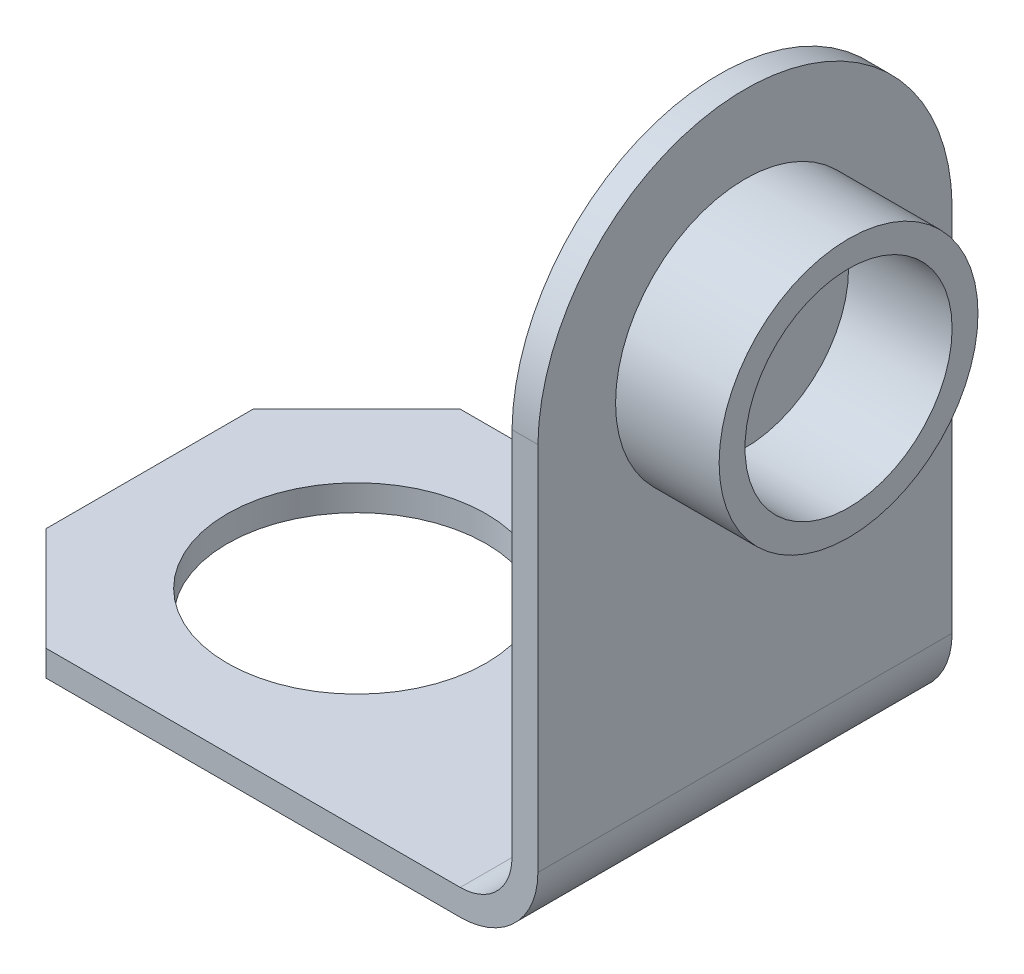
ISO-10303-21;
HEADER;
FILE_DESCRIPTION(('STEP AP214'),'2;1');
FILE_NAME('part.step','',(''),(''),'','','');
FILE_SCHEMA(('AUTOMOTIVE_DESIGN { 1 0 10303 214 1 1 1 1 }'));
ENDSEC;
DATA;
#1=APPLICATION_CONTEXT('core data for automotive mechanical design processes');
#2=APPLICATION_PROTOCOL_DEFINITION('international standard','automotive_design',2000,#1);
#3=PRODUCT_CONTEXT('',#1,'mechanical');
#4=PRODUCT('Part','Part','',(#3));
#5=PRODUCT_RELATED_PRODUCT_CATEGORY('part','',(#4));
#6=PRODUCT_DEFINITION_FORMATION('','',#4);
#7=PRODUCT_DEFINITION_CONTEXT('part definition',#1,'design');
#8=PRODUCT_DEFINITION('design','',#6,#7);
#9=PRODUCT_DEFINITION_SHAPE('','',#8);
#10=(LENGTH_UNIT() NAMED_UNIT(*) SI_UNIT(.MILLI.,.METRE.));
#11=(NAMED_UNIT(*) PLANE_ANGLE_UNIT() SI_UNIT($,.RADIAN.));
#12=(NAMED_UNIT(*) SI_UNIT($,.STERADIAN.) SOLID_ANGLE_UNIT());
#13=UNCERTAINTY_MEASURE_WITH_UNIT(LENGTH_MEASURE(1.E-05),#10,'distance_accuracy_value','');
#14=(GEOMETRIC_REPRESENTATION_CONTEXT(3) GLOBAL_UNCERTAINTY_ASSIGNED_CONTEXT((#13)) GLOBAL_UNIT_ASSIGNED_CONTEXT((#10,
#11,#12)) REPRESENTATION_CONTEXT('',''));
#15=CARTESIAN_POINT('',(0.,0.,0.));
#16=DIRECTION('',(0.,0.,1.));
#17=DIRECTION('',(1.,0.,0.));
#18=AXIS2_PLACEMENT_3D('',#15,#16,#17);
#19=CARTESIAN_POINT('',(55.,7.5,-40.));
#20=DIRECTION('',(-1.,0.,0.));
#21=DIRECTION('',(0.,0.,1.));
#22=AXIS2_PLACEMENT_3D('',#19,#20,#21);
#23=PLANE('',#22);
#24=CARTESIAN_POINT('',(55.,42.9979975021565,-20.));
#25=DIRECTION('',(-1.,0.,0.));
#26=DIRECTION('',(0.,0.,1.));
#27=AXIS2_PLACEMENT_3D('',#24,#25,#26);
#28=CIRCLE('',#27,20.0020024978435);
#29=CARTESIAN_POINT('',(55.,43.2810238679564,-40.));
#30=VERTEX_POINT('',#29);
#31=CARTESIAN_POINT('',(55.,43.2810238679555,0.));
#32=VERTEX_POINT('',#31);
#33=EDGE_CURVE('E136',#30,#32,#28,.F.);
#34=ORIENTED_EDGE('',*,*,#33,.F.);
#35=DIRECTION('',(0.,-1.,0.));
#36=VECTOR('',#35,1.);
#37=CARTESIAN_POINT('',(55.,7.5,-40.));
#38=LINE('',#37,#36);
#39=CARTESIAN_POINT('',(55.,7.5,-40.));
#40=VERTEX_POINT('',#39);
#41=EDGE_CURVE('E145',#30,#40,#38,.T.);
#42=ORIENTED_EDGE('',*,*,#41,.T.);
#43=DIRECTION('',(0.,0.,1.));
#44=VECTOR('',#43,1.);
#45=CARTESIAN_POINT('',(55.,7.5,-40.));
#46=LINE('',#45,#44);
#47=CARTESIAN_POINT('',(55.,7.5,0.));
#48=VERTEX_POINT('',#47);
#49=EDGE_CURVE('E181',#40,#48,#46,.T.);
#50=ORIENTED_EDGE('',*,*,#49,.T.);
#51=DIRECTION('',(0.,-1.,0.));
#52=VECTOR('',#51,1.);
#53=CARTESIAN_POINT('',(55.,7.5,0.));
#54=LINE('',#53,#52);
#55=EDGE_CURVE('E170',#32,#48,#54,.T.);
#56=ORIENTED_EDGE('',*,*,#55,.F.);
#57=EDGE_LOOP('',(#34,#42,#50,#56));
#58=FACE_BOUND('',#57,.T.);
#59=ADVANCED_FACE('F43',(#58),#23,.T.);
#60=CARTESIAN_POINT('',(57.5,7.5,-40.));
#61=DIRECTION('',(1.,0.,0.));
#62=DIRECTION('',(0.,0.,-1.));
#63=AXIS2_PLACEMENT_3D('',#60,#61,#62);
#64=PLANE('',#63);
#65=CARTESIAN_POINT('',(57.5,42.9979975021565,-20.));
#66=DIRECTION('',(1.,0.,0.));
#67=DIRECTION('',(0.,0.,-1.));
#68=AXIS2_PLACEMENT_3D('',#65,#66,#67);
#69=CIRCLE('',#68,12.5);
#70=CARTESIAN_POINT('',(57.5,42.9979975021565,-32.5));
#71=VERTEX_POINT('',#70);
#72=EDGE_CURVE('E218',#71,#71,#69,.T.);
#73=ORIENTED_EDGE('',*,*,#72,.F.);
#74=EDGE_LOOP('',(#73));
#75=FACE_BOUND('',#74,.T.);
#76=DIRECTION('',(0.,1.,0.));
#77=VECTOR('',#76,1.);
#78=CARTESIAN_POINT('',(57.5,7.5,-40.));
#79=LINE('',#78,#77);
#80=CARTESIAN_POINT('',(57.5,7.5,-40.));
#81=VERTEX_POINT('',#80);
#82=CARTESIAN_POINT('',(57.5,43.2810238679564,-40.));
#83=VERTEX_POINT('',#82);
#84=EDGE_CURVE('E142',#81,#83,#79,.T.);
#85=ORIENTED_EDGE('',*,*,#84,.T.);
#86=CARTESIAN_POINT('',(57.5,42.9979975021565,-20.));
#87=DIRECTION('',(1.,0.,0.));
#88=DIRECTION('',(0.,0.,-1.));
#89=AXIS2_PLACEMENT_3D('',#86,#87,#88);
#90=CIRCLE('',#89,20.0020024978435);
#91=CARTESIAN_POINT('',(57.5,43.2810238679555,0.));
#92=VERTEX_POINT('',#91);
#93=EDGE_CURVE('E125',#92,#83,#90,.F.);
#94=ORIENTED_EDGE('',*,*,#93,.F.);
#95=DIRECTION('',(0.,1.,0.));
#96=VECTOR('',#95,1.);
#97=CARTESIAN_POINT('',(57.5,7.5,0.));
#98=LINE('',#97,#96);
#99=CARTESIAN_POINT('',(57.5,7.5,0.));
#100=VERTEX_POINT('',#99);
#101=EDGE_CURVE('E168',#100,#92,#98,.T.);
#102=ORIENTED_EDGE('',*,*,#101,.F.);
#103=DIRECTION('',(0.,0.,1.));
#104=VECTOR('',#103,1.);
#105=CARTESIAN_POINT('',(57.5,7.5,-40.));
#106=LINE('',#105,#104);
#107=EDGE_CURVE('E149',#81,#100,#106,.T.);
#108=ORIENTED_EDGE('',*,*,#107,.F.);
#109=EDGE_LOOP('',(#85,#94,#102,#108));
#110=FACE_BOUND('',#109,.T.);
#111=ADVANCED_FACE('F148',(#75,#110),#64,.T.);
#112=CARTESIAN_POINT('',(0.,2.5,-40.));
#113=DIRECTION('',(-1.,0.,0.));
#114=DIRECTION('',(0.,0.,1.));
#115=AXIS2_PLACEMENT_3D('',#112,#113,#114);
#116=PLANE('',#115);
#117=DIRECTION('',(0.,0.,1.));
#118=VECTOR('',#117,1.);
#119=CARTESIAN_POINT('',(0.,2.5,-40.));
#120=LINE('',#119,#118);
#121=CARTESIAN_POINT('',(0.,2.5,-30.));
#122=VERTEX_POINT('',#121);
#123=CARTESIAN_POINT('',(0.,2.5,-10.));
#124=VERTEX_POINT('',#123);
#125=EDGE_CURVE('E177',#122,#124,#120,.T.);
#126=ORIENTED_EDGE('',*,*,#125,.F.);
#127=DIRECTION('',(0.,-1.,0.));
#128=VECTOR('',#127,1.);
#129=CARTESIAN_POINT('',(0.,0.,-30.));
#130=LINE('',#129,#128);
#131=CARTESIAN_POINT('',(0.,0.,-30.));
#132=VERTEX_POINT('',#131);
#133=EDGE_CURVE('E195',#122,#132,#130,.T.);
#134=ORIENTED_EDGE('',*,*,#133,.T.);
#135=DIRECTION('',(0.,0.,1.));
#136=VECTOR('',#135,1.);
#137=CARTESIAN_POINT('',(0.,0.,-40.));
#138=LINE('',#137,#136);
#139=CARTESIAN_POINT('',(0.,0.,-10.));
#140=VERTEX_POINT('',#139);
#141=EDGE_CURVE('E162',#132,#140,#138,.T.);
#142=ORIENTED_EDGE('',*,*,#141,.T.);
#143=DIRECTION('',(0.,1.,0.));
#144=VECTOR('',#143,1.);
#145=CARTESIAN_POINT('',(0.,2.5,-10.));
#146=LINE('',#145,#144);
#147=EDGE_CURVE('E193',#140,#124,#146,.T.);
#148=ORIENTED_EDGE('',*,*,#147,.T.);
#149=EDGE_LOOP('',(#126,#134,#142,#148));
#150=FACE_BOUND('',#149,.T.);
#151=ADVANCED_FACE('F209',(#150),#116,.T.);
#152=CARTESIAN_POINT('',(0.,2.5,-40.));
#153=DIRECTION('',(0.,1.,0.));
#154=DIRECTION('',(0.,0.,1.));
#155=AXIS2_PLACEMENT_3D('',#152,#153,#154);
#156=PLANE('',#155);
#157=CARTESIAN_POINT('',(20.,2.5,-20.));
#158=DIRECTION('',(0.,1.,0.));
#159=DIRECTION('',(0.,0.,1.));
#160=AXIS2_PLACEMENT_3D('',#157,#158,#159);
#161=CIRCLE('',#160,12.5);
#162=CARTESIAN_POINT('',(20.,2.5,-7.5));
#163=VERTEX_POINT('',#162);
#164=EDGE_CURVE('E222',#163,#163,#161,.T.);
#165=ORIENTED_EDGE('',*,*,#164,.F.);
#166=EDGE_LOOP('',(#165));
#167=FACE_BOUND('',#166,.T.);
#168=DIRECTION('',(-1.,0.,0.));
#169=VECTOR('',#168,1.);
#170=CARTESIAN_POINT('',(0.,2.5,-40.));
#171=LINE('',#170,#169);
#172=CARTESIAN_POINT('',(50.,2.5,-40.));
#173=VERTEX_POINT('',#172);
#174=CARTESIAN_POINT('',(10.,2.5,-40.));
#175=VERTEX_POINT('',#174);
#176=EDGE_CURVE('E160',#173,#175,#171,.T.);
#177=ORIENTED_EDGE('',*,*,#176,.T.);
#178=DIRECTION('',(-0.707106781186549,0.,0.707106781186547));
#179=VECTOR('',#178,1.);
#180=CARTESIAN_POINT('',(5.00000000000001,2.5,-35.));
#181=LINE('',#180,#179);
#182=EDGE_CURVE('E52',#175,#122,#181,.T.);
#183=ORIENTED_EDGE('',*,*,#182,.T.);
#184=ORIENTED_EDGE('',*,*,#125,.T.);
#185=DIRECTION('',(-0.707106781186547,0.,-0.707106781186549));
#186=VECTOR('',#185,1.);
#187=CARTESIAN_POINT('',(-15.,2.5,-25.0000000000001));
#188=LINE('',#187,#186);
#189=CARTESIAN_POINT('',(10.,2.5,0.));
#190=VERTEX_POINT('',#189);
#191=EDGE_CURVE('E59',#124,#190,#188,.F.);
#192=ORIENTED_EDGE('',*,*,#191,.T.);
#193=DIRECTION('',(-1.,0.,0.));
#194=VECTOR('',#193,1.);
#195=CARTESIAN_POINT('',(0.,2.5,0.));
#196=LINE('',#195,#194);
#197=CARTESIAN_POINT('',(50.,2.5,0.));
#198=VERTEX_POINT('',#197);
#199=EDGE_CURVE('E175',#198,#190,#196,.T.);
#200=ORIENTED_EDGE('',*,*,#199,.F.);
#201=DIRECTION('',(0.,0.,1.));
#202=VECTOR('',#201,1.);
#203=CARTESIAN_POINT('',(50.,2.5,-40.));
#204=LINE('',#203,#202);
#205=EDGE_CURVE('E179',#173,#198,#204,.T.);
#206=ORIENTED_EDGE('',*,*,#205,.F.);
#207=EDGE_LOOP('',(#177,#183,#184,#192,#200,#206));
#208=FACE_BOUND('',#207,.T.);
#209=ADVANCED_FACE('F205',(#167,#208),#156,.T.);
#210=CARTESIAN_POINT('',(50.,7.5,-40.));
#211=DIRECTION('',(0.,0.,1.));
#212=DIRECTION('',(1.,0.,0.));
#213=AXIS2_PLACEMENT_3D('',#210,#211,#212);
#214=CYLINDRICAL_SURFACE('',#213,5.);
#215=CARTESIAN_POINT('',(50.,7.5,0.));
#216=DIRECTION('',(0.,0.,-1.));
#217=DIRECTION('',(1.,0.,0.));
#218=AXIS2_PLACEMENT_3D('',#215,#216,#217);
#219=CIRCLE('',#218,5.);
#220=EDGE_CURVE('E172',#48,#198,#219,.T.);
#221=ORIENTED_EDGE('',*,*,#220,.F.);
#222=ORIENTED_EDGE('',*,*,#49,.F.);
#223=CARTESIAN_POINT('',(50.,7.5,-40.));
#224=DIRECTION('',(0.,0.,-1.));
#225=DIRECTION('',(1.,0.,0.));
#226=AXIS2_PLACEMENT_3D('',#223,#224,#225);
#227=CIRCLE('',#226,5.);
#228=EDGE_CURVE('E152',#40,#173,#227,.T.);
#229=ORIENTED_EDGE('',*,*,#228,.T.);
#230=ORIENTED_EDGE('',*,*,#205,.T.);
#231=EDGE_LOOP('',(#221,#222,#229,#230));
#232=FACE_BOUND('',#231,.T.);
#233=ADVANCED_FACE('F256',(#232),#214,.F.);
#234=CARTESIAN_POINT('',(50.,7.5,-40.));
#235=DIRECTION('',(0.,0.,1.));
#236=DIRECTION('',(1.,0.,0.));
#237=AXIS2_PLACEMENT_3D('',#234,#235,#236);
#238=CYLINDRICAL_SURFACE('',#237,7.5);
#239=CARTESIAN_POINT('',(50.,7.5,0.));
#240=DIRECTION('',(0.,0.,1.));
#241=DIRECTION('',(1.,0.,0.));
#242=AXIS2_PLACEMENT_3D('',#239,#240,#241);
#243=CIRCLE('',#242,7.5);
#244=CARTESIAN_POINT('',(50.,0.,0.));
#245=VERTEX_POINT('',#244);
#246=EDGE_CURVE('E165',#245,#100,#243,.T.);
#247=ORIENTED_EDGE('',*,*,#246,.F.);
#248=DIRECTION('',(0.,0.,1.));
#249=VECTOR('',#248,1.);
#250=CARTESIAN_POINT('',(50.,0.,-40.));
#251=LINE('',#250,#249);
#252=CARTESIAN_POINT('',(50.,0.,-40.));
#253=VERTEX_POINT('',#252);
#254=EDGE_CURVE('E185',#253,#245,#251,.T.);
#255=ORIENTED_EDGE('',*,*,#254,.F.);
#256=CARTESIAN_POINT('',(50.,7.5,-40.));
#257=DIRECTION('',(0.,0.,1.));
#258=DIRECTION('',(1.,0.,0.));
#259=AXIS2_PLACEMENT_3D('',#256,#257,#258);
#260=CIRCLE('',#259,7.5);
#261=EDGE_CURVE('E150',#253,#81,#260,.T.);
#262=ORIENTED_EDGE('',*,*,#261,.T.);
#263=ORIENTED_EDGE('',*,*,#107,.T.);
#264=EDGE_LOOP('',(#247,#255,#262,#263));
#265=FACE_BOUND('',#264,.T.);
#266=ADVANCED_FACE('F259',(#265),#238,.T.);
#267=CARTESIAN_POINT('',(0.,0.,-40.));
#268=DIRECTION('',(0.,-1.,0.));
#269=DIRECTION('',(0.,0.,-1.));
#270=AXIS2_PLACEMENT_3D('',#267,#268,#269);
#271=PLANE('',#270);
#272=CARTESIAN_POINT('',(20.,0.,-20.));
#273=DIRECTION('',(0.,1.,0.));
#274=DIRECTION('',(0.,0.,1.));
#275=AXIS2_PLACEMENT_3D('',#272,#273,#274);
#276=CIRCLE('',#275,12.5);
#277=CARTESIAN_POINT('',(20.,0.,-7.5));
#278=VERTEX_POINT('',#277);
#279=EDGE_CURVE('E229',#278,#278,#276,.T.);
#280=ORIENTED_EDGE('',*,*,#279,.T.);
#281=EDGE_LOOP('',(#280));
#282=FACE_BOUND('',#281,.T.);
#283=ORIENTED_EDGE('',*,*,#141,.F.);
#284=DIRECTION('',(0.707106781186549,0.,-0.707106781186547));
#285=VECTOR('',#284,1.);
#286=CARTESIAN_POINT('',(5.00000000000001,0.,-35.));
#287=LINE('',#286,#285);
#288=CARTESIAN_POINT('',(10.,0.,-40.));
#289=VERTEX_POINT('',#288);
#290=EDGE_CURVE('E200',#132,#289,#287,.T.);
#291=ORIENTED_EDGE('',*,*,#290,.T.);
#292=DIRECTION('',(1.,0.,0.));
#293=VECTOR('',#292,1.);
#294=CARTESIAN_POINT('',(0.,0.,-40.));
#295=LINE('',#294,#293);
#296=EDGE_CURVE('E154',#289,#253,#295,.T.);
#297=ORIENTED_EDGE('',*,*,#296,.T.);
#298=ORIENTED_EDGE('',*,*,#254,.T.);
#299=DIRECTION('',(1.,0.,0.));
#300=VECTOR('',#299,1.);
#301=CARTESIAN_POINT('',(0.,0.,0.));
#302=LINE('',#301,#300);
#303=CARTESIAN_POINT('',(10.,0.,0.));
#304=VERTEX_POINT('',#303);
#305=EDGE_CURVE('E163',#304,#245,#302,.T.);
#306=ORIENTED_EDGE('',*,*,#305,.F.);
#307=DIRECTION('',(0.707106781186547,0.,0.707106781186549));
#308=VECTOR('',#307,1.);
#309=CARTESIAN_POINT('',(-15.,0.,-25.0000000000001));
#310=LINE('',#309,#308);
#311=EDGE_CURVE('E198',#304,#140,#310,.F.);
#312=ORIENTED_EDGE('',*,*,#311,.T.);
#313=EDGE_LOOP('',(#283,#291,#297,#298,#306,#312));
#314=FACE_BOUND('',#313,.T.);
#315=ADVANCED_FACE('F214',(#282,#314),#271,.T.);
#316=CARTESIAN_POINT('',(50.,7.5,-40.));
#317=DIRECTION('',(0.,0.,1.));
#318=DIRECTION('',(1.,0.,0.));
#319=AXIS2_PLACEMENT_3D('',#316,#317,#318);
#320=PLANE('',#319);
#321=ORIENTED_EDGE('',*,*,#296,.F.);
#322=DIRECTION('',(0.,1.,0.));
#323=VECTOR('',#322,1.);
#324=CARTESIAN_POINT('',(10.,2.5,-40.));
#325=LINE('',#324,#323);
#326=EDGE_CURVE('E67',#289,#175,#325,.T.);
#327=ORIENTED_EDGE('',*,*,#326,.T.);
#328=ORIENTED_EDGE('',*,*,#176,.F.);
#329=ORIENTED_EDGE('',*,*,#228,.F.);
#330=ORIENTED_EDGE('',*,*,#41,.F.);
#331=DIRECTION('',(1.,0.,0.));
#332=VECTOR('',#331,1.);
#333=CARTESIAN_POINT('',(0.,43.2810238679564,-40.));
#334=LINE('',#333,#332);
#335=EDGE_CURVE('E128',#30,#83,#334,.T.);
#336=ORIENTED_EDGE('',*,*,#335,.T.);
#337=ORIENTED_EDGE('',*,*,#84,.F.);
#338=ORIENTED_EDGE('',*,*,#261,.F.);
#339=EDGE_LOOP('',(#321,#327,#328,#329,#330,#336,#337,#338));
#340=FACE_BOUND('',#339,.T.);
#341=ADVANCED_FACE('F140',(#340),#320,.F.);
#342=CARTESIAN_POINT('',(50.,7.5,0.));
#343=DIRECTION('',(0.,0.,1.));
#344=DIRECTION('',(1.,0.,0.));
#345=AXIS2_PLACEMENT_3D('',#342,#343,#344);
#346=PLANE('',#345);
#347=ORIENTED_EDGE('',*,*,#199,.T.);
#348=DIRECTION('',(0.,-1.,0.));
#349=VECTOR('',#348,1.);
#350=CARTESIAN_POINT('',(10.,7.5,0.));
#351=LINE('',#350,#349);
#352=EDGE_CURVE('E11',#190,#304,#351,.T.);
#353=ORIENTED_EDGE('',*,*,#352,.T.);
#354=ORIENTED_EDGE('',*,*,#305,.T.);
#355=ORIENTED_EDGE('',*,*,#246,.T.);
#356=ORIENTED_EDGE('',*,*,#101,.T.);
#357=DIRECTION('',(1.,0.,0.));
#358=VECTOR('',#357,1.);
#359=CARTESIAN_POINT('',(0.,43.2810238679555,0.));
#360=LINE('',#359,#358);
#361=EDGE_CURVE('E131',#32,#92,#360,.T.);
#362=ORIENTED_EDGE('',*,*,#361,.F.);
#363=ORIENTED_EDGE('',*,*,#55,.T.);
#364=ORIENTED_EDGE('',*,*,#220,.T.);
#365=EDGE_LOOP('',(#347,#353,#354,#355,#356,#362,#363,#364));
#366=FACE_BOUND('',#365,.T.);
#367=ADVANCED_FACE('F290',(#366),#346,.T.);
#368=CARTESIAN_POINT('',(0.,42.9979975021565,-20.));
#369=DIRECTION('',(1.,0.,0.));
#370=DIRECTION('',(0.,0.,-1.));
#371=AXIS2_PLACEMENT_3D('',#368,#369,#370);
#372=CYLINDRICAL_SURFACE('',#371,20.0020024978435);
#373=ORIENTED_EDGE('',*,*,#33,.T.);
#374=ORIENTED_EDGE('',*,*,#361,.T.);
#375=ORIENTED_EDGE('',*,*,#93,.T.);
#376=ORIENTED_EDGE('',*,*,#335,.F.);
#377=EDGE_LOOP('',(#373,#374,#375,#376));
#378=FACE_BOUND('',#377,.T.);
#379=ADVANCED_FACE('F127',(#378),#372,.T.);
#380=CARTESIAN_POINT('',(67.5,42.9979975021565,-20.));
#381=DIRECTION('',(-1.,0.,0.));
#382=DIRECTION('',(0.,0.,1.));
#383=AXIS2_PLACEMENT_3D('',#380,#381,#382);
#384=CYLINDRICAL_SURFACE('',#383,10.);
#385=CARTESIAN_POINT('',(67.5,42.9979975021565,-20.));
#386=DIRECTION('',(1.,0.,0.));
#387=DIRECTION('',(0.,0.,-1.));
#388=AXIS2_PLACEMENT_3D('',#385,#386,#387);
#389=CIRCLE('',#388,10.);
#390=CARTESIAN_POINT('',(67.5,42.9979975021565,-30.));
#391=VERTEX_POINT('',#390);
#392=EDGE_CURVE('E221',#391,#391,#389,.T.);
#393=ORIENTED_EDGE('',*,*,#392,.T.);
#394=EDGE_LOOP('',(#393));
#395=FACE_BOUND('',#394,.T.);
#396=CARTESIAN_POINT('',(57.5,42.9979975021565,-20.));
#397=DIRECTION('',(1.,0.,0.));
#398=DIRECTION('',(0.,0.,-1.));
#399=AXIS2_PLACEMENT_3D('',#396,#397,#398);
#400=CIRCLE('',#399,10.);
#401=CARTESIAN_POINT('',(57.5,42.9979975021565,-30.));
#402=VERTEX_POINT('',#401);
#403=EDGE_CURVE('E146',#402,#402,#400,.F.);
#404=ORIENTED_EDGE('',*,*,#403,.T.);
#405=EDGE_LOOP('',(#404));
#406=FACE_BOUND('',#405,.T.);
#407=ADVANCED_FACE('F281',(#395,#406),#384,.F.);
#408=CARTESIAN_POINT('',(67.5,42.9979975021565,-20.));
#409=DIRECTION('',(-1.,0.,0.));
#410=DIRECTION('',(0.,0.,1.));
#411=AXIS2_PLACEMENT_3D('',#408,#409,#410);
#412=CYLINDRICAL_SURFACE('',#411,12.5);
#413=CARTESIAN_POINT('',(67.5,42.9979975021565,-20.));
#414=DIRECTION('',(1.,0.,0.));
#415=DIRECTION('',(0.,0.,-1.));
#416=AXIS2_PLACEMENT_3D('',#413,#414,#415);
#417=CIRCLE('',#416,12.5);
#418=CARTESIAN_POINT('',(67.5,42.9979975021565,-32.5));
#419=VERTEX_POINT('',#418);
#420=EDGE_CURVE('E137',#419,#419,#417,.T.);
#421=ORIENTED_EDGE('',*,*,#420,.F.);
#422=EDGE_LOOP('',(#421));
#423=FACE_BOUND('',#422,.T.);
#424=ORIENTED_EDGE('',*,*,#72,.T.);
#425=EDGE_LOOP('',(#424));
#426=FACE_BOUND('',#425,.T.);
#427=ADVANCED_FACE('F277',(#423,#426),#412,.T.);
#428=CARTESIAN_POINT('',(67.5,0.,0.));
#429=DIRECTION('',(1.,0.,0.));
#430=DIRECTION('',(0.,0.,-1.));
#431=AXIS2_PLACEMENT_3D('',#428,#429,#430);
#432=PLANE('',#431);
#433=ORIENTED_EDGE('',*,*,#392,.F.);
#434=EDGE_LOOP('',(#433));
#435=FACE_BOUND('',#434,.T.);
#436=ORIENTED_EDGE('',*,*,#420,.T.);
#437=EDGE_LOOP('',(#436));
#438=FACE_BOUND('',#437,.T.);
#439=ADVANCED_FACE('F272',(#435,#438),#432,.T.);
#440=ORIENTED_EDGE('',*,*,#403,.F.);
#441=EDGE_LOOP('',(#440));
#442=FACE_BOUND('',#441,.T.);
#443=ADVANCED_FACE('F254',(#442),#64,.T.);
#444=CARTESIAN_POINT('',(0.,2.5,-30.));
#445=DIRECTION('',(-0.707106781186547,0.,-0.707106781186549));
#446=DIRECTION('',(0.,1.,0.));
#447=AXIS2_PLACEMENT_3D('',#444,#445,#446);
#448=PLANE('',#447);
#449=ORIENTED_EDGE('',*,*,#182,.F.);
#450=ORIENTED_EDGE('',*,*,#326,.F.);
#451=ORIENTED_EDGE('',*,*,#290,.F.);
#452=ORIENTED_EDGE('',*,*,#133,.F.);
#453=EDGE_LOOP('',(#449,#450,#451,#452));
#454=FACE_BOUND('',#453,.T.);
#455=ADVANCED_FACE('F212',(#454),#448,.T.);
#456=CARTESIAN_POINT('',(10.,7.5,0.));
#457=DIRECTION('',(0.707106781186549,0.,-0.707106781186547));
#458=DIRECTION('',(0.,-1.,0.));
#459=AXIS2_PLACEMENT_3D('',#456,#457,#458);
#460=PLANE('',#459);
#461=ORIENTED_EDGE('',*,*,#191,.F.);
#462=ORIENTED_EDGE('',*,*,#147,.F.);
#463=ORIENTED_EDGE('',*,*,#311,.F.);
#464=ORIENTED_EDGE('',*,*,#352,.F.);
#465=EDGE_LOOP('',(#461,#462,#463,#464));
#466=FACE_BOUND('',#465,.T.);
#467=ADVANCED_FACE('F46',(#466),#460,.F.);
#468=CARTESIAN_POINT('',(20.,0.,-20.));
#469=DIRECTION('',(0.,1.,0.));
#470=DIRECTION('',(0.,0.,1.));
#471=AXIS2_PLACEMENT_3D('',#468,#469,#470);
#472=CYLINDRICAL_SURFACE('',#471,12.5);
#473=ORIENTED_EDGE('',*,*,#164,.T.);
#474=EDGE_LOOP('',(#473));
#475=FACE_BOUND('',#474,.T.);
#476=ORIENTED_EDGE('',*,*,#279,.F.);
#477=EDGE_LOOP('',(#476));
#478=FACE_BOUND('',#477,.T.);
#479=ADVANCED_FACE('F234',(#475,#478),#472,.F.);
#480=CLOSED_SHELL('',(#59,#111,#151,#209,#233,#266,#315,#341,#367,#379,#407,#427,#439,#443,#455,
#467,#479));
#481=MANIFOLD_SOLID_BREP('B2',#480);
#482=ADVANCED_BREP_SHAPE_REPRESENTATION('',(#18,#481),#14);
#483=SHAPE_DEFINITION_REPRESENTATION(#9,#482);
ENDSEC;
END-ISO-10303-21;
